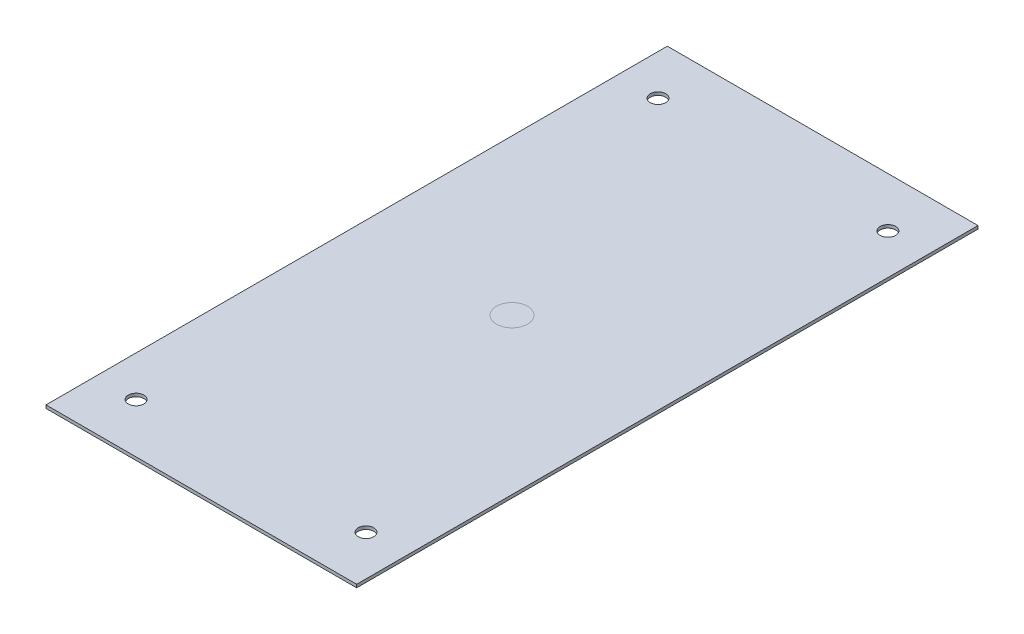
ISO-10303-21;
HEADER;
FILE_DESCRIPTION(('STEP AP214'),'2;1');
FILE_NAME('part.step','',(''),(''),'','','');
FILE_SCHEMA(('AUTOMOTIVE_DESIGN { 1 0 10303 214 1 1 1 1 }'));
ENDSEC;
DATA;
#1=APPLICATION_CONTEXT('core data for automotive mechanical design processes');
#2=APPLICATION_PROTOCOL_DEFINITION('international standard','automotive_design',2000,#1);
#3=PRODUCT_CONTEXT('',#1,'mechanical');
#4=PRODUCT('Part','Part','',(#3));
#5=PRODUCT_RELATED_PRODUCT_CATEGORY('part','',(#4));
#6=PRODUCT_DEFINITION_FORMATION('','',#4);
#7=PRODUCT_DEFINITION_CONTEXT('part definition',#1,'design');
#8=PRODUCT_DEFINITION('design','',#6,#7);
#9=PRODUCT_DEFINITION_SHAPE('','',#8);
#10=(LENGTH_UNIT() NAMED_UNIT(*) SI_UNIT(.MILLI.,.METRE.));
#11=(NAMED_UNIT(*) PLANE_ANGLE_UNIT() SI_UNIT($,.RADIAN.));
#12=(NAMED_UNIT(*) SI_UNIT($,.STERADIAN.) SOLID_ANGLE_UNIT());
#13=UNCERTAINTY_MEASURE_WITH_UNIT(LENGTH_MEASURE(1.E-05),#10,'distance_accuracy_value','');
#14=(GEOMETRIC_REPRESENTATION_CONTEXT(3) GLOBAL_UNCERTAINTY_ASSIGNED_CONTEXT((#13)) GLOBAL_UNIT_ASSIGNED_CONTEXT((#10,
#11,#12)) REPRESENTATION_CONTEXT('',''));
#15=CARTESIAN_POINT('',(0.,0.,0.));
#16=DIRECTION('',(0.,0.,1.));
#17=DIRECTION('',(1.,0.,0.));
#18=AXIS2_PLACEMENT_3D('',#15,#16,#17);
#19=CARTESIAN_POINT('',(0.,1.,0.));
#20=DIRECTION('',(0.,1.,0.));
#21=DIRECTION('',(0.,0.,1.));
#22=AXIS2_PLACEMENT_3D('',#19,#20,#21);
#23=PLANE('',#22);
#24=DIRECTION('',(0.,0.,1.));
#25=VECTOR('',#24,1.);
#26=CARTESIAN_POINT('',(-50.,1.,100.));
#27=LINE('',#26,#25);
#28=CARTESIAN_POINT('',(-50.,1.,-100.));
#29=VERTEX_POINT('',#28);
#30=CARTESIAN_POINT('',(-50.,1.,100.));
#31=VERTEX_POINT('',#30);
#32=EDGE_CURVE('E102',#29,#31,#27,.T.);
#33=ORIENTED_EDGE('',*,*,#32,.T.);
#34=DIRECTION('',(1.,0.,0.));
#35=VECTOR('',#34,1.);
#36=CARTESIAN_POINT('',(50.,1.,100.));
#37=LINE('',#36,#35);
#38=CARTESIAN_POINT('',(50.,1.,100.));
#39=VERTEX_POINT('',#38);
#40=EDGE_CURVE('E97',#31,#39,#37,.T.);
#41=ORIENTED_EDGE('',*,*,#40,.T.);
#42=DIRECTION('',(0.,0.,-1.));
#43=VECTOR('',#42,1.);
#44=CARTESIAN_POINT('',(50.,1.,100.));
#45=LINE('',#44,#43);
#46=CARTESIAN_POINT('',(50.,1.,-100.));
#47=VERTEX_POINT('',#46);
#48=EDGE_CURVE('E100',#39,#47,#45,.T.);
#49=ORIENTED_EDGE('',*,*,#48,.T.);
#50=DIRECTION('',(-1.,0.,0.));
#51=VECTOR('',#50,1.);
#52=CARTESIAN_POINT('',(50.,1.,-100.));
#53=LINE('',#52,#51);
#54=EDGE_CURVE('E66',#47,#29,#53,.T.);
#55=ORIENTED_EDGE('',*,*,#54,.T.);
#56=EDGE_LOOP('',(#33,#41,#49,#55));
#57=FACE_BOUND('',#56,.T.);
#58=CARTESIAN_POINT('',(37.,1.,-84.));
#59=DIRECTION('',(0.,1.,0.));
#60=DIRECTION('',(0.,0.,1.));
#61=AXIS2_PLACEMENT_3D('',#58,#59,#60);
#62=CIRCLE('',#61,2.5);
#63=CARTESIAN_POINT('',(37.,1.,-81.5));
#64=VERTEX_POINT('',#63);
#65=EDGE_CURVE('E149',#64,#64,#62,.T.);
#66=ORIENTED_EDGE('',*,*,#65,.F.);
#67=EDGE_LOOP('',(#66));
#68=FACE_BOUND('',#67,.T.);
#69=CARTESIAN_POINT('',(-37.,1.,-84.));
#70=DIRECTION('',(0.,-1.,0.));
#71=DIRECTION('',(0.,0.,1.));
#72=AXIS2_PLACEMENT_3D('',#69,#70,#71);
#73=CIRCLE('',#72,2.5);
#74=CARTESIAN_POINT('',(-37.,1.,-81.5));
#75=VERTEX_POINT('',#74);
#76=EDGE_CURVE('E134',#75,#75,#73,.T.);
#77=ORIENTED_EDGE('',*,*,#76,.T.);
#78=EDGE_LOOP('',(#77));
#79=FACE_BOUND('',#78,.T.);
#80=CARTESIAN_POINT('',(37.,1.,84.));
#81=DIRECTION('',(0.,-1.,0.));
#82=DIRECTION('',(0.,0.,-1.));
#83=AXIS2_PLACEMENT_3D('',#80,#81,#82);
#84=CIRCLE('',#83,2.5);
#85=CARTESIAN_POINT('',(37.,1.,81.5));
#86=VERTEX_POINT('',#85);
#87=EDGE_CURVE('E292',#86,#86,#84,.T.);
#88=ORIENTED_EDGE('',*,*,#87,.T.);
#89=EDGE_LOOP('',(#88));
#90=FACE_BOUND('',#89,.T.);
#91=CARTESIAN_POINT('',(-37.,1.,84.));
#92=DIRECTION('',(0.,1.,0.));
#93=DIRECTION('',(0.,0.,-1.));
#94=AXIS2_PLACEMENT_3D('',#91,#92,#93);
#95=CIRCLE('',#94,2.5);
#96=CARTESIAN_POINT('',(-37.,1.,81.5));
#97=VERTEX_POINT('',#96);
#98=EDGE_CURVE('E288',#97,#97,#95,.T.);
#99=ORIENTED_EDGE('',*,*,#98,.F.);
#100=EDGE_LOOP('',(#99));
#101=FACE_BOUND('',#100,.T.);
#102=CARTESIAN_POINT('',(0.,1.,0.));
#103=DIRECTION('',(0.,1.,0.));
#104=DIRECTION('',(0.,0.,1.));
#105=AXIS2_PLACEMENT_3D('',#102,#103,#104);
#106=CIRCLE('',#105,5.);
#107=CARTESIAN_POINT('',(0.,1.,5.));
#108=VERTEX_POINT('',#107);
#109=EDGE_CURVE('E12',#108,#108,#106,.F.);
#110=ORIENTED_EDGE('',*,*,#109,.T.);
#111=EDGE_LOOP('',(#110));
#112=FACE_BOUND('',#111,.T.);
#113=ADVANCED_FACE('F48',(#57,#68,#79,#90,#101,#112),#23,.T.);
#114=CARTESIAN_POINT('',(-50.,1.,100.));
#115=DIRECTION('',(1.,0.,0.));
#116=DIRECTION('',(0.,0.,-1.));
#117=AXIS2_PLACEMENT_3D('',#114,#115,#116);
#118=PLANE('',#117);
#119=DIRECTION('',(0.,0.,1.));
#120=VECTOR('',#119,1.);
#121=CARTESIAN_POINT('',(-50.,0.,100.));
#122=LINE('',#121,#120);
#123=CARTESIAN_POINT('',(-50.,0.,-100.));
#124=VERTEX_POINT('',#123);
#125=CARTESIAN_POINT('',(-50.,0.,100.));
#126=VERTEX_POINT('',#125);
#127=EDGE_CURVE('E148',#124,#126,#122,.T.);
#128=ORIENTED_EDGE('',*,*,#127,.T.);
#129=DIRECTION('',(0.,-1.,0.));
#130=VECTOR('',#129,1.);
#131=CARTESIAN_POINT('',(-50.,1.,100.));
#132=LINE('',#131,#130);
#133=EDGE_CURVE('E58',#31,#126,#132,.T.);
#134=ORIENTED_EDGE('',*,*,#133,.F.);
#135=ORIENTED_EDGE('',*,*,#32,.F.);
#136=DIRECTION('',(0.,-1.,0.));
#137=VECTOR('',#136,1.);
#138=CARTESIAN_POINT('',(-50.,1.,-100.));
#139=LINE('',#138,#137);
#140=EDGE_CURVE('E118',#29,#124,#139,.T.);
#141=ORIENTED_EDGE('',*,*,#140,.T.);
#142=EDGE_LOOP('',(#128,#134,#135,#141));
#143=FACE_BOUND('',#142,.T.);
#144=ADVANCED_FACE('F50',(#143),#118,.F.);
#145=CARTESIAN_POINT('',(50.,1.,100.));
#146=DIRECTION('',(0.,0.,-1.));
#147=DIRECTION('',(-1.,0.,0.));
#148=AXIS2_PLACEMENT_3D('',#145,#146,#147);
#149=PLANE('',#148);
#150=DIRECTION('',(1.,0.,0.));
#151=VECTOR('',#150,1.);
#152=CARTESIAN_POINT('',(50.,0.,100.));
#153=LINE('',#152,#151);
#154=CARTESIAN_POINT('',(50.,0.,100.));
#155=VERTEX_POINT('',#154);
#156=EDGE_CURVE('E108',#126,#155,#153,.T.);
#157=ORIENTED_EDGE('',*,*,#156,.T.);
#158=DIRECTION('',(0.,-1.,0.));
#159=VECTOR('',#158,1.);
#160=CARTESIAN_POINT('',(50.,1.,100.));
#161=LINE('',#160,#159);
#162=EDGE_CURVE('E106',#39,#155,#161,.T.);
#163=ORIENTED_EDGE('',*,*,#162,.F.);
#164=ORIENTED_EDGE('',*,*,#40,.F.);
#165=ORIENTED_EDGE('',*,*,#133,.T.);
#166=EDGE_LOOP('',(#157,#163,#164,#165));
#167=FACE_BOUND('',#166,.T.);
#168=ADVANCED_FACE('F107',(#167),#149,.F.);
#169=CARTESIAN_POINT('',(50.,1.,100.));
#170=DIRECTION('',(-1.,0.,0.));
#171=DIRECTION('',(0.,0.,1.));
#172=AXIS2_PLACEMENT_3D('',#169,#170,#171);
#173=PLANE('',#172);
#174=DIRECTION('',(0.,0.,-1.));
#175=VECTOR('',#174,1.);
#176=CARTESIAN_POINT('',(50.,0.,100.));
#177=LINE('',#176,#175);
#178=CARTESIAN_POINT('',(50.,0.,-100.));
#179=VERTEX_POINT('',#178);
#180=EDGE_CURVE('E83',#155,#179,#177,.T.);
#181=ORIENTED_EDGE('',*,*,#180,.T.);
#182=DIRECTION('',(0.,-1.,0.));
#183=VECTOR('',#182,1.);
#184=CARTESIAN_POINT('',(50.,1.,-100.));
#185=LINE('',#184,#183);
#186=EDGE_CURVE('E109',#47,#179,#185,.T.);
#187=ORIENTED_EDGE('',*,*,#186,.F.);
#188=ORIENTED_EDGE('',*,*,#48,.F.);
#189=ORIENTED_EDGE('',*,*,#162,.T.);
#190=EDGE_LOOP('',(#181,#187,#188,#189));
#191=FACE_BOUND('',#190,.T.);
#192=ADVANCED_FACE('F111',(#191),#173,.F.);
#193=CARTESIAN_POINT('',(50.,1.,-100.));
#194=DIRECTION('',(0.,0.,1.));
#195=DIRECTION('',(1.,0.,0.));
#196=AXIS2_PLACEMENT_3D('',#193,#194,#195);
#197=PLANE('',#196);
#198=DIRECTION('',(-1.,0.,0.));
#199=VECTOR('',#198,1.);
#200=CARTESIAN_POINT('',(50.,0.,-100.));
#201=LINE('',#200,#199);
#202=EDGE_CURVE('E89',#179,#124,#201,.T.);
#203=ORIENTED_EDGE('',*,*,#202,.T.);
#204=ORIENTED_EDGE('',*,*,#140,.F.);
#205=ORIENTED_EDGE('',*,*,#54,.F.);
#206=ORIENTED_EDGE('',*,*,#186,.T.);
#207=EDGE_LOOP('',(#203,#204,#205,#206));
#208=FACE_BOUND('',#207,.T.);
#209=ADVANCED_FACE('F209',(#208),#197,.F.);
#210=ORIENTED_EDGE('',*,*,#109,.F.);
#211=EDGE_LOOP('',(#210));
#212=FACE_BOUND('',#211,.T.);
#213=ADVANCED_FACE('F191',(#212),#23,.T.);
#214=CARTESIAN_POINT('',(0.,0.,0.));
#215=DIRECTION('',(0.,1.,0.));
#216=DIRECTION('',(0.,0.,1.));
#217=AXIS2_PLACEMENT_3D('',#214,#215,#216);
#218=PLANE('',#217);
#219=CARTESIAN_POINT('',(-37.,0.,84.));
#220=DIRECTION('',(0.,1.,0.));
#221=DIRECTION('',(0.,0.,-1.));
#222=AXIS2_PLACEMENT_3D('',#219,#220,#221);
#223=CIRCLE('',#222,2.5);
#224=CARTESIAN_POINT('',(-37.,0.,81.5));
#225=VERTEX_POINT('',#224);
#226=EDGE_CURVE('E285',#225,#225,#223,.T.);
#227=ORIENTED_EDGE('',*,*,#226,.T.);
#228=EDGE_LOOP('',(#227));
#229=FACE_BOUND('',#228,.T.);
#230=CARTESIAN_POINT('',(37.,0.,84.));
#231=DIRECTION('',(0.,-1.,0.));
#232=DIRECTION('',(0.,0.,-1.));
#233=AXIS2_PLACEMENT_3D('',#230,#231,#232);
#234=CIRCLE('',#233,2.5);
#235=CARTESIAN_POINT('',(37.,0.,81.5));
#236=VERTEX_POINT('',#235);
#237=EDGE_CURVE('E141',#236,#236,#234,.T.);
#238=ORIENTED_EDGE('',*,*,#237,.F.);
#239=EDGE_LOOP('',(#238));
#240=FACE_BOUND('',#239,.T.);
#241=CARTESIAN_POINT('',(-37.,0.,-84.));
#242=DIRECTION('',(0.,-1.,0.));
#243=DIRECTION('',(0.,0.,1.));
#244=AXIS2_PLACEMENT_3D('',#241,#242,#243);
#245=CIRCLE('',#244,2.5);
#246=CARTESIAN_POINT('',(-37.,0.,-81.5));
#247=VERTEX_POINT('',#246);
#248=EDGE_CURVE('E140',#247,#247,#245,.T.);
#249=ORIENTED_EDGE('',*,*,#248,.F.);
#250=EDGE_LOOP('',(#249));
#251=FACE_BOUND('',#250,.T.);
#252=CARTESIAN_POINT('',(37.,0.,-84.));
#253=DIRECTION('',(0.,1.,0.));
#254=DIRECTION('',(0.,0.,1.));
#255=AXIS2_PLACEMENT_3D('',#252,#253,#254);
#256=CIRCLE('',#255,2.5);
#257=CARTESIAN_POINT('',(37.,0.,-81.5));
#258=VERTEX_POINT('',#257);
#259=EDGE_CURVE('E144',#258,#258,#256,.T.);
#260=ORIENTED_EDGE('',*,*,#259,.T.);
#261=EDGE_LOOP('',(#260));
#262=FACE_BOUND('',#261,.T.);
#263=ORIENTED_EDGE('',*,*,#127,.F.);
#264=ORIENTED_EDGE('',*,*,#202,.F.);
#265=ORIENTED_EDGE('',*,*,#180,.F.);
#266=ORIENTED_EDGE('',*,*,#156,.F.);
#267=EDGE_LOOP('',(#263,#264,#265,#266));
#268=FACE_BOUND('',#267,.T.);
#269=ADVANCED_FACE('F187',(#229,#240,#251,#262,#268),#218,.F.);
#270=CARTESIAN_POINT('',(37.,0.,-84.));
#271=DIRECTION('',(0.,1.,0.));
#272=DIRECTION('',(0.,0.,1.));
#273=AXIS2_PLACEMENT_3D('',#270,#271,#272);
#274=CYLINDRICAL_SURFACE('',#273,2.5);
#275=ORIENTED_EDGE('',*,*,#259,.F.);
#276=EDGE_LOOP('',(#275));
#277=FACE_BOUND('',#276,.T.);
#278=ORIENTED_EDGE('',*,*,#65,.T.);
#279=EDGE_LOOP('',(#278));
#280=FACE_BOUND('',#279,.T.);
#281=ADVANCED_FACE('F190',(#277,#280),#274,.F.);
#282=CARTESIAN_POINT('',(-37.,0.,-84.));
#283=DIRECTION('',(0.,1.,0.));
#284=DIRECTION('',(0.,0.,1.));
#285=AXIS2_PLACEMENT_3D('',#282,#283,#284);
#286=CYLINDRICAL_SURFACE('',#285,2.5);
#287=ORIENTED_EDGE('',*,*,#248,.T.);
#288=EDGE_LOOP('',(#287));
#289=FACE_BOUND('',#288,.T.);
#290=ORIENTED_EDGE('',*,*,#76,.F.);
#291=EDGE_LOOP('',(#290));
#292=FACE_BOUND('',#291,.T.);
#293=ADVANCED_FACE('F184',(#289,#292),#286,.F.);
#294=CARTESIAN_POINT('',(37.,0.,84.));
#295=DIRECTION('',(0.,1.,0.));
#296=DIRECTION('',(0.,0.,1.));
#297=AXIS2_PLACEMENT_3D('',#294,#295,#296);
#298=CYLINDRICAL_SURFACE('',#297,2.5);
#299=ORIENTED_EDGE('',*,*,#237,.T.);
#300=EDGE_LOOP('',(#299));
#301=FACE_BOUND('',#300,.T.);
#302=ORIENTED_EDGE('',*,*,#87,.F.);
#303=EDGE_LOOP('',(#302));
#304=FACE_BOUND('',#303,.T.);
#305=ADVANCED_FACE('F201',(#301,#304),#298,.F.);
#306=CARTESIAN_POINT('',(-37.,0.,84.));
#307=DIRECTION('',(0.,1.,0.));
#308=DIRECTION('',(0.,0.,1.));
#309=AXIS2_PLACEMENT_3D('',#306,#307,#308);
#310=CYLINDRICAL_SURFACE('',#309,2.5);
#311=ORIENTED_EDGE('',*,*,#226,.F.);
#312=EDGE_LOOP('',(#311));
#313=FACE_BOUND('',#312,.T.);
#314=ORIENTED_EDGE('',*,*,#98,.T.);
#315=EDGE_LOOP('',(#314));
#316=FACE_BOUND('',#315,.T.);
#317=ADVANCED_FACE('F258',(#313,#316),#310,.F.);
#318=CLOSED_SHELL('',(#113,#144,#168,#192,#209,#213,#269,#281,#293,#305,#317));
#319=MANIFOLD_SOLID_BREP('B2',#318);
#320=ADVANCED_BREP_SHAPE_REPRESENTATION('',(#18,#319),#14);
#321=SHAPE_DEFINITION_REPRESENTATION(#9,#320);
ENDSEC;
END-ISO-10303-21;
